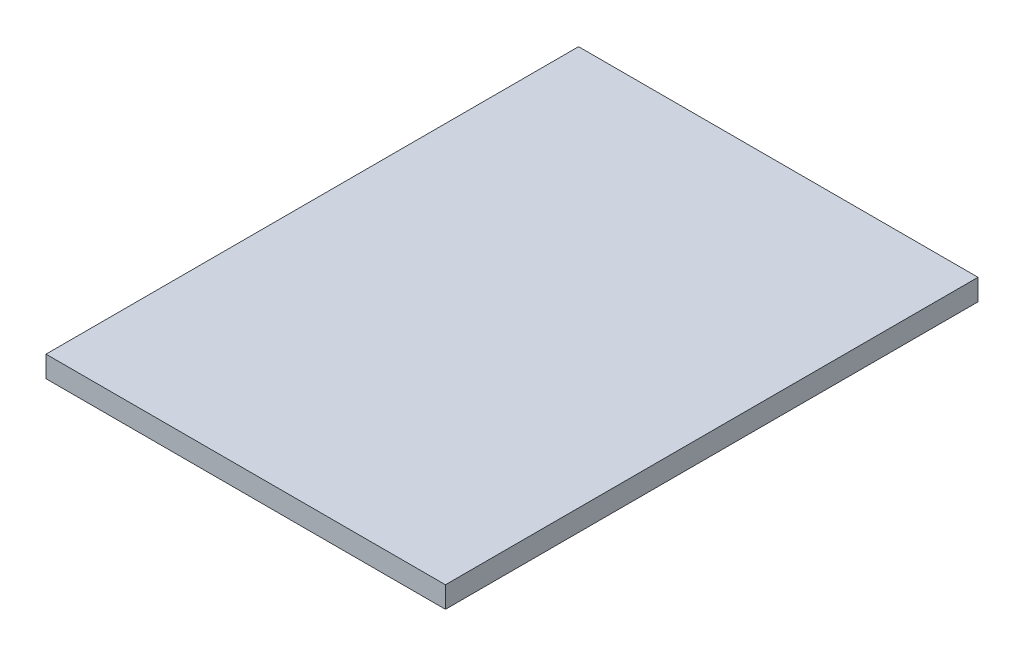
ISO-10303-21;
HEADER;
FILE_DESCRIPTION(('STEP AP214'),'2;1');
FILE_NAME('part.step','',(''),(''),'','','');
FILE_SCHEMA(('AUTOMOTIVE_DESIGN { 1 0 10303 214 1 1 1 1 }'));
ENDSEC;
DATA;
#1=APPLICATION_CONTEXT('core data for automotive mechanical design processes');
#2=APPLICATION_PROTOCOL_DEFINITION('international standard','automotive_design',2000,#1);
#3=PRODUCT_CONTEXT('',#1,'mechanical');
#4=PRODUCT('Part','Part','',(#3));
#5=PRODUCT_RELATED_PRODUCT_CATEGORY('part','',(#4));
#6=PRODUCT_DEFINITION_FORMATION('','',#4);
#7=PRODUCT_DEFINITION_CONTEXT('part definition',#1,'design');
#8=PRODUCT_DEFINITION('design','',#6,#7);
#9=PRODUCT_DEFINITION_SHAPE('','',#8);
#10=(LENGTH_UNIT() NAMED_UNIT(*) SI_UNIT(.MILLI.,.METRE.));
#11=(NAMED_UNIT(*) PLANE_ANGLE_UNIT() SI_UNIT($,.RADIAN.));
#12=(NAMED_UNIT(*) SI_UNIT($,.STERADIAN.) SOLID_ANGLE_UNIT());
#13=UNCERTAINTY_MEASURE_WITH_UNIT(LENGTH_MEASURE(1.E-05),#10,'distance_accuracy_value','');
#14=(GEOMETRIC_REPRESENTATION_CONTEXT(3) GLOBAL_UNCERTAINTY_ASSIGNED_CONTEXT((#13)) GLOBAL_UNIT_ASSIGNED_CONTEXT((#10,
#11,#12)) REPRESENTATION_CONTEXT('',''));
#15=CARTESIAN_POINT('',(0.,0.,0.));
#16=DIRECTION('',(0.,0.,1.));
#17=DIRECTION('',(1.,0.,0.));
#18=AXIS2_PLACEMENT_3D('',#15,#16,#17);
#19=CARTESIAN_POINT('',(0.,14.,0.));
#20=DIRECTION('',(0.,1.,0.));
#21=DIRECTION('',(0.,0.,1.));
#22=AXIS2_PLACEMENT_3D('',#19,#20,#21);
#23=PLANE('',#22);
#24=DIRECTION('',(-1.,0.,0.));
#25=VECTOR('',#24,1.);
#26=CARTESIAN_POINT('',(105.63580681881,14.,21.8149741733953));
#27=LINE('',#26,#25);
#28=CARTESIAN_POINT('',(180.63580681881,14.,21.8149741733953));
#29=VERTEX_POINT('',#28);
#30=CARTESIAN_POINT('',(105.63580681881,14.,21.8149741733953));
#31=VERTEX_POINT('',#30);
#32=EDGE_CURVE('E73',#29,#31,#27,.T.);
#33=ORIENTED_EDGE('',*,*,#32,.T.);
#34=DIRECTION('',(0.,0.,1.));
#35=VECTOR('',#34,1.);
#36=CARTESIAN_POINT('',(105.63580681881,14.,21.8149741733953));
#37=LINE('',#36,#35);
#38=CARTESIAN_POINT('',(105.63580681881,14.,121.814974173395));
#39=VERTEX_POINT('',#38);
#40=EDGE_CURVE('E45',#31,#39,#37,.T.);
#41=ORIENTED_EDGE('',*,*,#40,.T.);
#42=DIRECTION('',(1.,0.,0.));
#43=VECTOR('',#42,1.);
#44=CARTESIAN_POINT('',(105.63580681881,14.,121.814974173395));
#45=LINE('',#44,#43);
#46=CARTESIAN_POINT('',(180.63580681881,14.,121.814974173395));
#47=VERTEX_POINT('',#46);
#48=EDGE_CURVE('E79',#39,#47,#45,.T.);
#49=ORIENTED_EDGE('',*,*,#48,.T.);
#50=DIRECTION('',(0.,0.,-1.));
#51=VECTOR('',#50,1.);
#52=CARTESIAN_POINT('',(180.63580681881,14.,21.8149741733953));
#53=LINE('',#52,#51);
#54=EDGE_CURVE('E76',#47,#29,#53,.T.);
#55=ORIENTED_EDGE('',*,*,#54,.T.);
#56=EDGE_LOOP('',(#33,#41,#49,#55));
#57=FACE_BOUND('',#56,.T.);
#58=ADVANCED_FACE('F36',(#57),#23,.T.);
#59=CARTESIAN_POINT('',(0.,10.,0.));
#60=DIRECTION('',(0.,1.,0.));
#61=DIRECTION('',(0.,0.,1.));
#62=AXIS2_PLACEMENT_3D('',#59,#60,#61);
#63=PLANE('',#62);
#64=DIRECTION('',(-1.,0.,0.));
#65=VECTOR('',#64,1.);
#66=CARTESIAN_POINT('',(105.63580681881,10.,21.8149741733953));
#67=LINE('',#66,#65);
#68=CARTESIAN_POINT('',(180.63580681881,9.99999999999999,21.8149741733953));
#69=VERTEX_POINT('',#68);
#70=CARTESIAN_POINT('',(105.63580681881,10.,21.8149741733953));
#71=VERTEX_POINT('',#70);
#72=EDGE_CURVE('E93',#69,#71,#67,.T.);
#73=ORIENTED_EDGE('',*,*,#72,.F.);
#74=DIRECTION('',(0.,0.,-1.));
#75=VECTOR('',#74,1.);
#76=CARTESIAN_POINT('',(180.63580681881,9.99999999999999,21.8149741733953));
#77=LINE('',#76,#75);
#78=CARTESIAN_POINT('',(180.63580681881,10.,121.814974173395));
#79=VERTEX_POINT('',#78);
#80=EDGE_CURVE('E90',#79,#69,#77,.T.);
#81=ORIENTED_EDGE('',*,*,#80,.F.);
#82=DIRECTION('',(1.,0.,0.));
#83=VECTOR('',#82,1.);
#84=CARTESIAN_POINT('',(105.63580681881,10.,121.814974173395));
#85=LINE('',#84,#83);
#86=CARTESIAN_POINT('',(105.63580681881,10.,121.814974173395));
#87=VERTEX_POINT('',#86);
#88=EDGE_CURVE('E54',#87,#79,#85,.T.);
#89=ORIENTED_EDGE('',*,*,#88,.F.);
#90=DIRECTION('',(0.,0.,1.));
#91=VECTOR('',#90,1.);
#92=CARTESIAN_POINT('',(105.63580681881,10.,21.8149741733953));
#93=LINE('',#92,#91);
#94=EDGE_CURVE('E12',#71,#87,#93,.T.);
#95=ORIENTED_EDGE('',*,*,#94,.F.);
#96=EDGE_LOOP('',(#73,#81,#89,#95));
#97=FACE_BOUND('',#96,.T.);
#98=ADVANCED_FACE('F132',(#97),#63,.F.);
#99=CARTESIAN_POINT('',(105.63580681881,10.,21.8149741733953));
#100=DIRECTION('',(0.,0.,-1.));
#101=DIRECTION('',(-1.,0.,0.));
#102=AXIS2_PLACEMENT_3D('',#99,#100,#101);
#103=PLANE('',#102);
#104=ORIENTED_EDGE('',*,*,#32,.F.);
#105=DIRECTION('',(0.,1.,0.));
#106=VECTOR('',#105,1.);
#107=CARTESIAN_POINT('',(180.63580681881,9.99999999999999,21.8149741733953));
#108=LINE('',#107,#106);
#109=EDGE_CURVE('E88',#69,#29,#108,.T.);
#110=ORIENTED_EDGE('',*,*,#109,.F.);
#111=ORIENTED_EDGE('',*,*,#72,.T.);
#112=DIRECTION('',(0.,1.,0.));
#113=VECTOR('',#112,1.);
#114=CARTESIAN_POINT('',(105.63580681881,10.,21.8149741733953));
#115=LINE('',#114,#113);
#116=EDGE_CURVE('E84',#71,#31,#115,.T.);
#117=ORIENTED_EDGE('',*,*,#116,.T.);
#118=EDGE_LOOP('',(#104,#110,#111,#117));
#119=FACE_BOUND('',#118,.T.);
#120=ADVANCED_FACE('F94',(#119),#103,.T.);
#121=CARTESIAN_POINT('',(180.63580681881,9.99999999999999,21.8149741733953));
#122=DIRECTION('',(1.,0.,0.));
#123=DIRECTION('',(0.,0.,-1.));
#124=AXIS2_PLACEMENT_3D('',#121,#122,#123);
#125=PLANE('',#124);
#126=ORIENTED_EDGE('',*,*,#54,.F.);
#127=DIRECTION('',(0.,1.,0.));
#128=VECTOR('',#127,1.);
#129=CARTESIAN_POINT('',(180.63580681881,10.,121.814974173395));
#130=LINE('',#129,#128);
#131=EDGE_CURVE('E83',#79,#47,#130,.T.);
#132=ORIENTED_EDGE('',*,*,#131,.F.);
#133=ORIENTED_EDGE('',*,*,#80,.T.);
#134=ORIENTED_EDGE('',*,*,#109,.T.);
#135=EDGE_LOOP('',(#126,#132,#133,#134));
#136=FACE_BOUND('',#135,.T.);
#137=ADVANCED_FACE('F89',(#136),#125,.T.);
#138=CARTESIAN_POINT('',(105.63580681881,10.,121.814974173395));
#139=DIRECTION('',(0.,0.,1.));
#140=DIRECTION('',(1.,0.,0.));
#141=AXIS2_PLACEMENT_3D('',#138,#139,#140);
#142=PLANE('',#141);
#143=ORIENTED_EDGE('',*,*,#48,.F.);
#144=DIRECTION('',(0.,1.,0.));
#145=VECTOR('',#144,1.);
#146=CARTESIAN_POINT('',(105.63580681881,10.,121.814974173395));
#147=LINE('',#146,#145);
#148=EDGE_CURVE('E108',#87,#39,#147,.T.);
#149=ORIENTED_EDGE('',*,*,#148,.F.);
#150=ORIENTED_EDGE('',*,*,#88,.T.);
#151=ORIENTED_EDGE('',*,*,#131,.T.);
#152=EDGE_LOOP('',(#143,#149,#150,#151));
#153=FACE_BOUND('',#152,.T.);
#154=ADVANCED_FACE('F119',(#153),#142,.T.);
#155=CARTESIAN_POINT('',(105.63580681881,10.,21.8149741733953));
#156=DIRECTION('',(-1.,0.,0.));
#157=DIRECTION('',(0.,0.,1.));
#158=AXIS2_PLACEMENT_3D('',#155,#156,#157);
#159=PLANE('',#158);
#160=ORIENTED_EDGE('',*,*,#40,.F.);
#161=ORIENTED_EDGE('',*,*,#116,.F.);
#162=ORIENTED_EDGE('',*,*,#94,.T.);
#163=ORIENTED_EDGE('',*,*,#148,.T.);
#164=EDGE_LOOP('',(#160,#161,#162,#163));
#165=FACE_BOUND('',#164,.T.);
#166=ADVANCED_FACE('F134',(#165),#159,.T.);
#167=CLOSED_SHELL('',(#58,#98,#120,#137,#154,#166));
#168=MANIFOLD_SOLID_BREP('B2',#167);
#169=ADVANCED_BREP_SHAPE_REPRESENTATION('',(#18,#168),#14);
#170=SHAPE_DEFINITION_REPRESENTATION(#9,#169);
ENDSEC;
END-ISO-10303-21;
